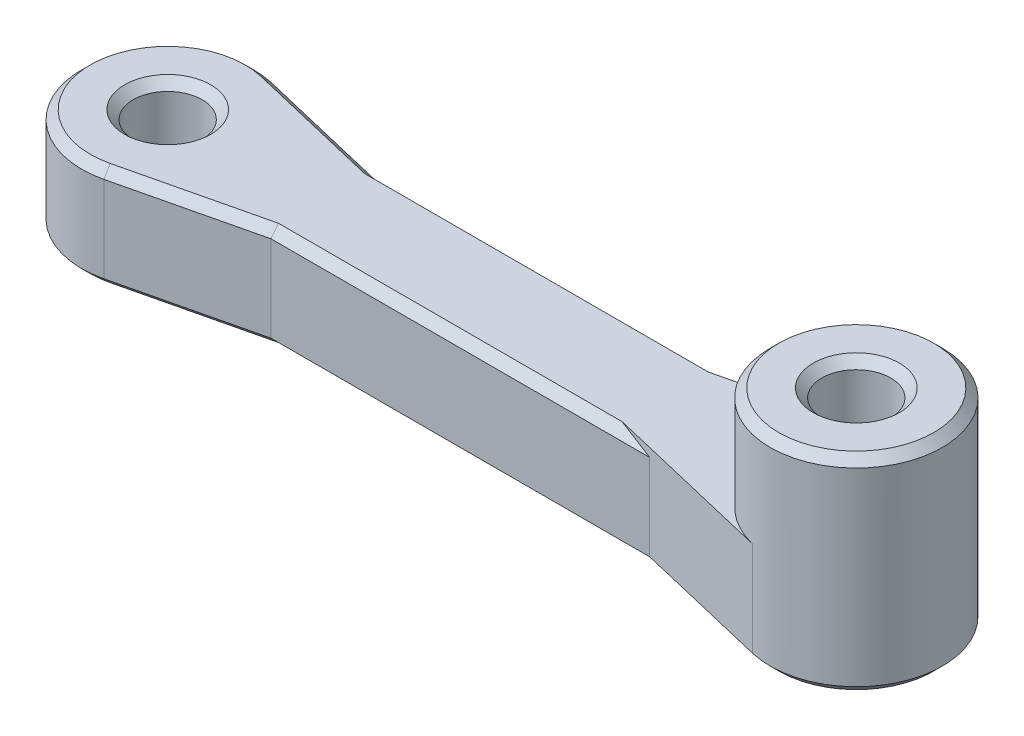
ISO-10303-21;
HEADER;
FILE_DESCRIPTION(('STEP AP214'),'2;1');
FILE_NAME('part.step','',(''),(''),'','','');
FILE_SCHEMA(('AUTOMOTIVE_DESIGN { 1 0 10303 214 1 1 1 1 }'));
ENDSEC;
DATA;
#1=APPLICATION_CONTEXT('core data for automotive mechanical design processes');
#2=APPLICATION_PROTOCOL_DEFINITION('international standard','automotive_design',2000,#1);
#3=PRODUCT_CONTEXT('',#1,'mechanical');
#4=PRODUCT('Part','Part','',(#3));
#5=PRODUCT_RELATED_PRODUCT_CATEGORY('part','',(#4));
#6=PRODUCT_DEFINITION_FORMATION('','',#4);
#7=PRODUCT_DEFINITION_CONTEXT('part definition',#1,'design');
#8=PRODUCT_DEFINITION('design','',#6,#7);
#9=PRODUCT_DEFINITION_SHAPE('','',#8);
#10=(LENGTH_UNIT() NAMED_UNIT(*) SI_UNIT(.MILLI.,.METRE.));
#11=(NAMED_UNIT(*) PLANE_ANGLE_UNIT() SI_UNIT($,.RADIAN.));
#12=(NAMED_UNIT(*) SI_UNIT($,.STERADIAN.) SOLID_ANGLE_UNIT());
#13=UNCERTAINTY_MEASURE_WITH_UNIT(LENGTH_MEASURE(1.E-05),#10,'distance_accuracy_value','');
#14=(GEOMETRIC_REPRESENTATION_CONTEXT(3) GLOBAL_UNCERTAINTY_ASSIGNED_CONTEXT((#13)) GLOBAL_UNIT_ASSIGNED_CONTEXT((#10,
#11,#12)) REPRESENTATION_CONTEXT('',''));
#15=CARTESIAN_POINT('',(0.,0.,0.));
#16=DIRECTION('',(0.,0.,1.));
#17=DIRECTION('',(1.,0.,0.));
#18=AXIS2_PLACEMENT_3D('',#15,#16,#17);
#19=CARTESIAN_POINT('',(2.,3.,-1.5));
#20=DIRECTION('',(0.,0.,1.));
#21=DIRECTION('',(1.,0.,0.));
#22=AXIS2_PLACEMENT_3D('',#19,#20,#21);
#23=PLANE('',#22);
#24=DIRECTION('',(0.,-1.,0.));
#25=VECTOR('',#24,1.);
#26=CARTESIAN_POINT('',(4.5,7.03112887414928,-1.5));
#27=LINE('',#26,#25);
#28=CARTESIAN_POINT('',(4.5,2.75,-1.5));
#29=VERTEX_POINT('',#28);
#30=CARTESIAN_POINT('',(4.5,0.25,-1.5));
#31=VERTEX_POINT('',#30);
#32=EDGE_CURVE('E196',#29,#31,#27,.T.);
#33=ORIENTED_EDGE('',*,*,#32,.F.);
#34=DIRECTION('',(1.,0.,0.));
#35=VECTOR('',#34,1.);
#36=CARTESIAN_POINT('',(15.5,2.75,-1.5));
#37=LINE('',#36,#35);
#38=CARTESIAN_POINT('',(15.5,2.75,-1.50000000000001));
#39=VERTEX_POINT('',#38);
#40=EDGE_CURVE('E295',#29,#39,#37,.T.);
#41=ORIENTED_EDGE('',*,*,#40,.T.);
#42=DIRECTION('',(0.,-1.,0.));
#43=VECTOR('',#42,1.);
#44=CARTESIAN_POINT('',(15.5,7.03112887414928,-1.50000000000001));
#45=LINE('',#44,#43);
#46=CARTESIAN_POINT('',(15.5,0.25,-1.50000000000001));
#47=VERTEX_POINT('',#46);
#48=EDGE_CURVE('E164',#39,#47,#45,.T.);
#49=ORIENTED_EDGE('',*,*,#48,.T.);
#50=DIRECTION('',(-1.,0.,0.));
#51=VECTOR('',#50,1.);
#52=CARTESIAN_POINT('',(2.,0.25,-1.5));
#53=LINE('',#52,#51);
#54=EDGE_CURVE('E229',#47,#31,#53,.T.);
#55=ORIENTED_EDGE('',*,*,#54,.T.);
#56=EDGE_LOOP('',(#33,#41,#49,#55));
#57=FACE_BOUND('',#56,.T.);
#58=ADVANCED_FACE('F43',(#57),#23,.F.);
#59=CARTESIAN_POINT('',(20.,3.,0.));
#60=DIRECTION('',(0.,-1.,0.));
#61=DIRECTION('',(0.,0.,-1.));
#62=AXIS2_PLACEMENT_3D('',#59,#60,#61);
#63=CYLINDRICAL_SURFACE('',#62,2.5);
#64=CARTESIAN_POINT('',(20.,5.75,0.));
#65=DIRECTION('',(0.,1.,0.));
#66=DIRECTION('',(0.,0.,1.));
#67=AXIS2_PLACEMENT_3D('',#64,#65,#66);
#68=CIRCLE('',#67,2.5);
#69=CARTESIAN_POINT('',(20.,5.75,2.5));
#70=VERTEX_POINT('',#69);
#71=EDGE_CURVE('E273',#70,#70,#68,.F.);
#72=ORIENTED_EDGE('',*,*,#71,.T.);
#73=EDGE_LOOP('',(#72));
#74=FACE_BOUND('',#73,.T.);
#75=DIRECTION('',(0.,-1.,0.));
#76=VECTOR('',#75,1.);
#77=CARTESIAN_POINT('',(19.4218548123582,7.03112887414928,2.4322311037413));
#78=LINE('',#77,#76);
#79=CARTESIAN_POINT('',(19.4218548123582,3.,2.4322311037413));
#80=VERTEX_POINT('',#79);
#81=CARTESIAN_POINT('',(19.4218548123582,0.25,2.4322311037413));
#82=VERTEX_POINT('',#81);
#83=EDGE_CURVE('E163',#80,#82,#78,.T.);
#84=ORIENTED_EDGE('',*,*,#83,.T.);
#85=CARTESIAN_POINT('',(20.,0.25,0.));
#86=DIRECTION('',(0.,1.,0.));
#87=DIRECTION('',(0.,0.,1.));
#88=AXIS2_PLACEMENT_3D('',#85,#86,#87);
#89=CIRCLE('',#88,2.5);
#90=CARTESIAN_POINT('',(19.4218548123582,0.25,-2.43223110374131));
#91=VERTEX_POINT('',#90);
#92=EDGE_CURVE('E172',#82,#91,#89,.T.);
#93=ORIENTED_EDGE('',*,*,#92,.T.);
#94=DIRECTION('',(0.,-1.,0.));
#95=VECTOR('',#94,1.);
#96=CARTESIAN_POINT('',(19.4218548123582,7.03112887414928,-2.43223110374131));
#97=LINE('',#96,#95);
#98=CARTESIAN_POINT('',(19.4218548123582,3.,-2.43223110374131));
#99=VERTEX_POINT('',#98);
#100=EDGE_CURVE('E155',#99,#91,#97,.T.);
#101=ORIENTED_EDGE('',*,*,#100,.F.);
#102=CARTESIAN_POINT('',(20.,3.,0.));
#103=DIRECTION('',(0.,1.,0.));
#104=DIRECTION('',(0.,0.,1.));
#105=AXIS2_PLACEMENT_3D('',#102,#103,#104);
#106=CIRCLE('',#105,2.5);
#107=EDGE_CURVE('E170',#99,#80,#106,.T.);
#108=ORIENTED_EDGE('',*,*,#107,.T.);
#109=EDGE_LOOP('',(#84,#93,#101,#108));
#110=FACE_BOUND('',#109,.T.);
#111=ADVANCED_FACE('F169',(#74,#110),#63,.T.);
#112=CARTESIAN_POINT('',(18.,3.,1.5));
#113=DIRECTION('',(0.,0.,-1.));
#114=DIRECTION('',(-1.,0.,0.));
#115=AXIS2_PLACEMENT_3D('',#112,#113,#114);
#116=PLANE('',#115);
#117=DIRECTION('',(0.,-1.,0.));
#118=VECTOR('',#117,1.);
#119=CARTESIAN_POINT('',(15.5,7.03112887414928,1.5));
#120=LINE('',#119,#118);
#121=CARTESIAN_POINT('',(15.5,2.75,1.5));
#122=VERTEX_POINT('',#121);
#123=CARTESIAN_POINT('',(15.5,0.25,1.5));
#124=VERTEX_POINT('',#123);
#125=EDGE_CURVE('E190',#122,#124,#120,.T.);
#126=ORIENTED_EDGE('',*,*,#125,.F.);
#127=DIRECTION('',(-1.,0.,0.));
#128=VECTOR('',#127,1.);
#129=CARTESIAN_POINT('',(4.5,2.75,1.5));
#130=LINE('',#129,#128);
#131=CARTESIAN_POINT('',(4.5,2.75,1.5));
#132=VERTEX_POINT('',#131);
#133=EDGE_CURVE('E66',#122,#132,#130,.T.);
#134=ORIENTED_EDGE('',*,*,#133,.T.);
#135=DIRECTION('',(0.,-1.,0.));
#136=VECTOR('',#135,1.);
#137=CARTESIAN_POINT('',(4.5,7.03112887414928,1.5));
#138=LINE('',#137,#136);
#139=CARTESIAN_POINT('',(4.5,0.25,1.5));
#140=VERTEX_POINT('',#139);
#141=EDGE_CURVE('E194',#132,#140,#138,.T.);
#142=ORIENTED_EDGE('',*,*,#141,.T.);
#143=DIRECTION('',(1.,0.,0.));
#144=VECTOR('',#143,1.);
#145=CARTESIAN_POINT('',(18.,0.25,1.5));
#146=LINE('',#145,#144);
#147=EDGE_CURVE('E241',#140,#124,#146,.T.);
#148=ORIENTED_EDGE('',*,*,#147,.T.);
#149=EDGE_LOOP('',(#126,#134,#142,#148));
#150=FACE_BOUND('',#149,.T.);
#151=ADVANCED_FACE('F339',(#150),#116,.F.);
#152=CARTESIAN_POINT('',(0.,3.,0.));
#153=DIRECTION('',(0.,-1.,0.));
#154=DIRECTION('',(0.,0.,-1.));
#155=AXIS2_PLACEMENT_3D('',#152,#153,#154);
#156=CYLINDRICAL_SURFACE('',#155,2.5);
#157=DIRECTION('',(0.,-1.,0.));
#158=VECTOR('',#157,1.);
#159=CARTESIAN_POINT('',(0.578145187641785,7.03112887414928,2.4322311037413));
#160=LINE('',#159,#158);
#161=CARTESIAN_POINT('',(0.578145187641785,2.75,2.4322311037413));
#162=VERTEX_POINT('',#161);
#163=CARTESIAN_POINT('',(0.578145187641785,0.25,2.4322311037413));
#164=VERTEX_POINT('',#163);
#165=EDGE_CURVE('E189',#162,#164,#160,.T.);
#166=ORIENTED_EDGE('',*,*,#165,.F.);
#167=CARTESIAN_POINT('',(0.,2.75,0.));
#168=DIRECTION('',(0.,1.,0.));
#169=DIRECTION('',(0.,0.,1.));
#170=AXIS2_PLACEMENT_3D('',#167,#168,#169);
#171=CIRCLE('',#170,2.5);
#172=CARTESIAN_POINT('',(0.578145187641785,2.75,-2.4322311037413));
#173=VERTEX_POINT('',#172);
#174=EDGE_CURVE('E299',#162,#173,#171,.F.);
#175=ORIENTED_EDGE('',*,*,#174,.T.);
#176=DIRECTION('',(0.,-1.,0.));
#177=VECTOR('',#176,1.);
#178=CARTESIAN_POINT('',(0.578145187641785,7.03112887414928,-2.4322311037413));
#179=LINE('',#178,#177);
#180=CARTESIAN_POINT('',(0.578145187641785,0.25,-2.4322311037413));
#181=VERTEX_POINT('',#180);
#182=EDGE_CURVE('E198',#173,#181,#179,.T.);
#183=ORIENTED_EDGE('',*,*,#182,.T.);
#184=CARTESIAN_POINT('',(0.,0.25,0.));
#185=DIRECTION('',(0.,1.,0.));
#186=DIRECTION('',(0.,0.,1.));
#187=AXIS2_PLACEMENT_3D('',#184,#185,#186);
#188=CIRCLE('',#187,2.5);
#189=EDGE_CURVE('E235',#181,#164,#188,.T.);
#190=ORIENTED_EDGE('',*,*,#189,.T.);
#191=EDGE_LOOP('',(#166,#175,#183,#190));
#192=FACE_BOUND('',#191,.T.);
#193=ADVANCED_FACE('F349',(#192),#156,.T.);
#194=CARTESIAN_POINT('',(0.,3.,0.));
#195=DIRECTION('',(0.,1.,0.));
#196=DIRECTION('',(0.,0.,1.));
#197=AXIS2_PLACEMENT_3D('',#194,#195,#196);
#198=PLANE('',#197);
#199=CARTESIAN_POINT('',(0.,3.,0.));
#200=DIRECTION('',(0.,1.,0.));
#201=DIRECTION('',(0.,0.,1.));
#202=AXIS2_PLACEMENT_3D('',#199,#200,#201);
#203=CIRCLE('',#202,1.25);
#204=CARTESIAN_POINT('',(0.,3.,1.25));
#205=VERTEX_POINT('',#204);
#206=EDGE_CURVE('E292',#205,#205,#203,.F.);
#207=ORIENTED_EDGE('',*,*,#206,.T.);
#208=EDGE_LOOP('',(#207));
#209=FACE_BOUND('',#208,.T.);
#210=DIRECTION('',(-0.972892441496522,0.,0.231258075056714));
#211=VECTOR('',#210,1.);
#212=CARTESIAN_POINT('',(15.5,3.,-1.50000000000001));
#213=LINE('',#212,#211);
#214=CARTESIAN_POINT('',(14.4482611134142,3.,-1.25));
#215=VERTEX_POINT('',#214);
#216=EDGE_CURVE('E151',#99,#215,#213,.T.);
#217=ORIENTED_EDGE('',*,*,#216,.T.);
#218=DIRECTION('',(-1.,0.,0.));
#219=VECTOR('',#218,1.);
#220=CARTESIAN_POINT('',(4.5,3.,-1.25));
#221=LINE('',#220,#219);
#222=CARTESIAN_POINT('',(4.47069555463433,3.,-1.25));
#223=VERTEX_POINT('',#222);
#224=EDGE_CURVE('E290',#215,#223,#221,.T.);
#225=ORIENTED_EDGE('',*,*,#224,.T.);
#226=DIRECTION('',(-0.972892441496522,0.,-0.231258075056714));
#227=VECTOR('',#226,1.);
#228=CARTESIAN_POINT('',(0.520330668877606,3.,-2.18900799336717));
#229=LINE('',#228,#227);
#230=CARTESIAN_POINT('',(0.520330668877606,3.,-2.18900799336717));
#231=VERTEX_POINT('',#230);
#232=EDGE_CURVE('E288',#223,#231,#229,.T.);
#233=ORIENTED_EDGE('',*,*,#232,.T.);
#234=CARTESIAN_POINT('',(0.,3.,0.));
#235=DIRECTION('',(0.,1.,0.));
#236=DIRECTION('',(0.,0.,1.));
#237=AXIS2_PLACEMENT_3D('',#234,#235,#236);
#238=CIRCLE('',#237,2.25);
#239=CARTESIAN_POINT('',(0.520330668877607,3.,2.18900799336717));
#240=VERTEX_POINT('',#239);
#241=EDGE_CURVE('E286',#231,#240,#238,.T.);
#242=ORIENTED_EDGE('',*,*,#241,.T.);
#243=DIRECTION('',(0.972892441496522,0.,-0.231258075056714));
#244=VECTOR('',#243,1.);
#245=CARTESIAN_POINT('',(4.44218548123582,3.,1.25677688962587));
#246=LINE('',#245,#244);
#247=CARTESIAN_POINT('',(4.47069555463433,3.,1.25));
#248=VERTEX_POINT('',#247);
#249=EDGE_CURVE('E284',#240,#248,#246,.T.);
#250=ORIENTED_EDGE('',*,*,#249,.T.);
#251=DIRECTION('',(1.,0.,0.));
#252=VECTOR('',#251,1.);
#253=CARTESIAN_POINT('',(15.5000000000001,3.,1.25));
#254=LINE('',#253,#252);
#255=CARTESIAN_POINT('',(14.4482611134142,3.,1.25));
#256=VERTEX_POINT('',#255);
#257=EDGE_CURVE('E282',#248,#256,#254,.T.);
#258=ORIENTED_EDGE('',*,*,#257,.T.);
#259=DIRECTION('',(0.972892441496522,0.,0.231258075056715));
#260=VECTOR('',#259,1.);
#261=CARTESIAN_POINT('',(15.5,3.,1.5));
#262=LINE('',#261,#260);
#263=EDGE_CURVE('E178',#256,#80,#262,.T.);
#264=ORIENTED_EDGE('',*,*,#263,.T.);
#265=ORIENTED_EDGE('',*,*,#107,.F.);
#266=EDGE_LOOP('',(#217,#225,#233,#242,#250,#258,#264,#265));
#267=FACE_BOUND('',#266,.T.);
#268=ADVANCED_FACE('F176',(#209,#267),#198,.T.);
#269=CARTESIAN_POINT('',(0.,0.,0.));
#270=DIRECTION('',(0.,1.,0.));
#271=DIRECTION('',(0.,0.,1.));
#272=AXIS2_PLACEMENT_3D('',#269,#270,#271);
#273=PLANE('',#272);
#274=CARTESIAN_POINT('',(20.,0.,0.));
#275=DIRECTION('',(0.,1.,0.));
#276=DIRECTION('',(0.,0.,1.));
#277=AXIS2_PLACEMENT_3D('',#274,#275,#276);
#278=CIRCLE('',#277,1.25);
#279=CARTESIAN_POINT('',(20.,0.,1.25));
#280=VERTEX_POINT('',#279);
#281=EDGE_CURVE('E220',#280,#280,#278,.T.);
#282=ORIENTED_EDGE('',*,*,#281,.T.);
#283=EDGE_LOOP('',(#282));
#284=FACE_BOUND('',#283,.T.);
#285=CARTESIAN_POINT('',(0.,0.,0.));
#286=DIRECTION('',(0.,1.,0.));
#287=DIRECTION('',(0.,0.,1.));
#288=AXIS2_PLACEMENT_3D('',#285,#286,#287);
#289=CIRCLE('',#288,1.25);
#290=CARTESIAN_POINT('',(0.,0.,1.25));
#291=VERTEX_POINT('',#290);
#292=EDGE_CURVE('E217',#291,#291,#289,.T.);
#293=ORIENTED_EDGE('',*,*,#292,.T.);
#294=EDGE_LOOP('',(#293));
#295=FACE_BOUND('',#294,.T.);
#296=DIRECTION('',(0.972892441496522,0.,0.231258075056714));
#297=VECTOR('',#296,1.);
#298=CARTESIAN_POINT('',(0.520330668877606,0.,-2.18900799336717));
#299=LINE('',#298,#297);
#300=CARTESIAN_POINT('',(0.520330668877607,0.,-2.18900799336717));
#301=VERTEX_POINT('',#300);
#302=CARTESIAN_POINT('',(4.47069555463433,0.,-1.25));
#303=VERTEX_POINT('',#302);
#304=EDGE_CURVE('E212',#301,#303,#299,.T.);
#305=ORIENTED_EDGE('',*,*,#304,.T.);
#306=DIRECTION('',(1.,0.,0.));
#307=VECTOR('',#306,1.);
#308=CARTESIAN_POINT('',(0.,0.,-1.25));
#309=LINE('',#308,#307);
#310=CARTESIAN_POINT('',(15.5293044453657,0.,-1.25));
#311=VERTEX_POINT('',#310);
#312=EDGE_CURVE('E214',#303,#311,#309,.T.);
#313=ORIENTED_EDGE('',*,*,#312,.T.);
#314=DIRECTION('',(0.972892441496522,0.,-0.231258075056714));
#315=VECTOR('',#314,1.);
#316=CARTESIAN_POINT('',(0.549275276701128,0.,2.31077667178707));
#317=LINE('',#316,#315);
#318=CARTESIAN_POINT('',(19.4796693311224,0.,-2.18900799336717));
#319=VERTEX_POINT('',#318);
#320=EDGE_CURVE('E200',#311,#319,#317,.T.);
#321=ORIENTED_EDGE('',*,*,#320,.T.);
#322=CARTESIAN_POINT('',(20.,0.,0.));
#323=DIRECTION('',(0.,1.,0.));
#324=DIRECTION('',(0.,0.,1.));
#325=AXIS2_PLACEMENT_3D('',#322,#323,#324);
#326=CIRCLE('',#325,2.25);
#327=CARTESIAN_POINT('',(19.4796693311224,0.,2.18900799336717));
#328=VERTEX_POINT('',#327);
#329=EDGE_CURVE('E202',#319,#328,#326,.F.);
#330=ORIENTED_EDGE('',*,*,#329,.T.);
#331=DIRECTION('',(-0.972892441496522,0.,-0.231258075056715));
#332=VECTOR('',#331,1.);
#333=CARTESIAN_POINT('',(0.549275276701135,0.,-2.31077667178709));
#334=LINE('',#333,#332);
#335=CARTESIAN_POINT('',(15.5293044453657,0.,1.25));
#336=VERTEX_POINT('',#335);
#337=EDGE_CURVE('E204',#328,#336,#334,.T.);
#338=ORIENTED_EDGE('',*,*,#337,.T.);
#339=DIRECTION('',(-1.,0.,0.));
#340=VECTOR('',#339,1.);
#341=CARTESIAN_POINT('',(0.,0.,1.25));
#342=LINE('',#341,#340);
#343=CARTESIAN_POINT('',(4.47069555463433,0.,1.25));
#344=VERTEX_POINT('',#343);
#345=EDGE_CURVE('E206',#336,#344,#342,.T.);
#346=ORIENTED_EDGE('',*,*,#345,.T.);
#347=DIRECTION('',(-0.972892441496522,0.,0.231258075056714));
#348=VECTOR('',#347,1.);
#349=CARTESIAN_POINT('',(0.520330668877607,0.,2.18900799336717));
#350=LINE('',#349,#348);
#351=CARTESIAN_POINT('',(0.520330668877607,0.,2.18900799336717));
#352=VERTEX_POINT('',#351);
#353=EDGE_CURVE('E208',#344,#352,#350,.T.);
#354=ORIENTED_EDGE('',*,*,#353,.T.);
#355=CARTESIAN_POINT('',(0.,0.,0.));
#356=DIRECTION('',(0.,1.,0.));
#357=DIRECTION('',(0.,0.,1.));
#358=AXIS2_PLACEMENT_3D('',#355,#356,#357);
#359=CIRCLE('',#358,2.25);
#360=EDGE_CURVE('E210',#352,#301,#359,.F.);
#361=ORIENTED_EDGE('',*,*,#360,.T.);
#362=EDGE_LOOP('',(#305,#313,#321,#330,#338,#346,#354,#361));
#363=FACE_BOUND('',#362,.T.);
#364=ADVANCED_FACE('F344',(#284,#295,#363),#273,.F.);
#365=CARTESIAN_POINT('',(20.,5.82842712474619,0.));
#366=DIRECTION('',(0.,-1.,0.));
#367=DIRECTION('',(0.,0.,-1.));
#368=AXIS2_PLACEMENT_3D('',#365,#366,#367);
#369=CYLINDRICAL_SURFACE('',#368,1.);
#370=CARTESIAN_POINT('',(20.,5.75,0.));
#371=DIRECTION('',(0.,1.,0.));
#372=DIRECTION('',(0.,0.,1.));
#373=AXIS2_PLACEMENT_3D('',#370,#371,#372);
#374=CIRCLE('',#373,1.);
#375=CARTESIAN_POINT('',(20.,5.75,1.));
#376=VERTEX_POINT('',#375);
#377=EDGE_CURVE('E276',#376,#376,#374,.T.);
#378=ORIENTED_EDGE('',*,*,#377,.T.);
#379=EDGE_LOOP('',(#378));
#380=FACE_BOUND('',#379,.T.);
#381=CARTESIAN_POINT('',(20.,0.249999999999999,0.));
#382=DIRECTION('',(0.,1.,0.));
#383=DIRECTION('',(0.,0.,1.));
#384=AXIS2_PLACEMENT_3D('',#381,#382,#383);
#385=CIRCLE('',#384,1.);
#386=CARTESIAN_POINT('',(20.,0.249999999999999,1.));
#387=VERTEX_POINT('',#386);
#388=EDGE_CURVE('E223',#387,#387,#385,.F.);
#389=ORIENTED_EDGE('',*,*,#388,.T.);
#390=EDGE_LOOP('',(#389));
#391=FACE_BOUND('',#390,.T.);
#392=ADVANCED_FACE('F501',(#380,#391),#369,.F.);
#393=CARTESIAN_POINT('',(0.,5.82842712474619,0.));
#394=DIRECTION('',(0.,-1.,0.));
#395=DIRECTION('',(0.,0.,-1.));
#396=AXIS2_PLACEMENT_3D('',#393,#394,#395);
#397=CYLINDRICAL_SURFACE('',#396,1.);
#398=CARTESIAN_POINT('',(0.,2.75,0.));
#399=DIRECTION('',(0.,1.,0.));
#400=DIRECTION('',(0.,0.,1.));
#401=AXIS2_PLACEMENT_3D('',#398,#399,#400);
#402=CIRCLE('',#401,1.);
#403=CARTESIAN_POINT('',(0.,2.75,1.));
#404=VERTEX_POINT('',#403);
#405=EDGE_CURVE('E279',#404,#404,#402,.T.);
#406=ORIENTED_EDGE('',*,*,#405,.T.);
#407=EDGE_LOOP('',(#406));
#408=FACE_BOUND('',#407,.T.);
#409=CARTESIAN_POINT('',(0.,0.250000000000001,0.));
#410=DIRECTION('',(0.,1.,0.));
#411=DIRECTION('',(0.,0.,1.));
#412=AXIS2_PLACEMENT_3D('',#409,#410,#411);
#413=CIRCLE('',#412,1.);
#414=CARTESIAN_POINT('',(0.,0.250000000000001,1.));
#415=VERTEX_POINT('',#414);
#416=EDGE_CURVE('E226',#415,#415,#413,.F.);
#417=ORIENTED_EDGE('',*,*,#416,.T.);
#418=EDGE_LOOP('',(#417));
#419=FACE_BOUND('',#418,.T.);
#420=ADVANCED_FACE('F507',(#408,#419),#397,.F.);
#421=CARTESIAN_POINT('',(4.5,7.03112887414928,-1.5));
#422=DIRECTION('',(-0.231258075056714,0.,0.972892441496522));
#423=DIRECTION('',(0.972892441496522,0.,0.231258075056714));
#424=AXIS2_PLACEMENT_3D('',#421,#422,#423);
#425=PLANE('',#424);
#426=ORIENTED_EDGE('',*,*,#182,.F.);
#427=DIRECTION('',(0.972892441496522,0.,0.231258075056714));
#428=VECTOR('',#427,1.);
#429=CARTESIAN_POINT('',(4.5,2.75,-1.5));
#430=LINE('',#429,#428);
#431=EDGE_CURVE('E297',#173,#29,#430,.T.);
#432=ORIENTED_EDGE('',*,*,#431,.T.);
#433=ORIENTED_EDGE('',*,*,#32,.T.);
#434=DIRECTION('',(-0.972892441496522,0.,-0.231258075056714));
#435=VECTOR('',#434,1.);
#436=CARTESIAN_POINT('',(4.5,0.25,-1.5));
#437=LINE('',#436,#435);
#438=EDGE_CURVE('E232',#31,#181,#437,.T.);
#439=ORIENTED_EDGE('',*,*,#438,.T.);
#440=EDGE_LOOP('',(#426,#432,#433,#439));
#441=FACE_BOUND('',#440,.T.);
#442=ADVANCED_FACE('F583',(#441),#425,.F.);
#443=CARTESIAN_POINT('',(4.5,7.03112887414928,1.5));
#444=DIRECTION('',(-0.231258075056714,0.,-0.972892441496522));
#445=DIRECTION('',(-0.972892441496522,0.,0.231258075056714));
#446=AXIS2_PLACEMENT_3D('',#443,#444,#445);
#447=PLANE('',#446);
#448=ORIENTED_EDGE('',*,*,#141,.F.);
#449=DIRECTION('',(-0.972892441496522,0.,0.231258075056714));
#450=VECTOR('',#449,1.);
#451=CARTESIAN_POINT('',(0.578145187641785,2.75,2.4322311037413));
#452=LINE('',#451,#450);
#453=EDGE_CURVE('E301',#132,#162,#452,.T.);
#454=ORIENTED_EDGE('',*,*,#453,.T.);
#455=ORIENTED_EDGE('',*,*,#165,.T.);
#456=DIRECTION('',(0.972892441496522,0.,-0.231258075056714));
#457=VECTOR('',#456,1.);
#458=CARTESIAN_POINT('',(4.5,0.25,1.5));
#459=LINE('',#458,#457);
#460=EDGE_CURVE('E238',#164,#140,#459,.T.);
#461=ORIENTED_EDGE('',*,*,#460,.T.);
#462=EDGE_LOOP('',(#448,#454,#455,#461));
#463=FACE_BOUND('',#462,.T.);
#464=ADVANCED_FACE('F576',(#463),#447,.F.);
#465=CARTESIAN_POINT('',(15.5,7.03112887414928,1.5));
#466=DIRECTION('',(0.231258075056715,0.,-0.972892441496522));
#467=DIRECTION('',(-0.972892441496522,0.,-0.231258075056715));
#468=AXIS2_PLACEMENT_3D('',#465,#466,#467);
#469=PLANE('',#468);
#470=ORIENTED_EDGE('',*,*,#263,.F.);
#471=DIRECTION('',(0.947876203725968,-0.225311675696188,0.225311675696185));
#472=VECTOR('',#471,1.);
#473=CARTESIAN_POINT('',(14.5856896846005,2.96733301085016,1.28266698914985));
#474=LINE('',#473,#472);
#475=EDGE_CURVE('E11',#256,#122,#474,.T.);
#476=ORIENTED_EDGE('',*,*,#475,.T.);
#477=ORIENTED_EDGE('',*,*,#125,.T.);
#478=DIRECTION('',(0.972892441496522,0.,0.231258075056715));
#479=VECTOR('',#478,1.);
#480=CARTESIAN_POINT('',(15.5,0.25,1.5));
#481=LINE('',#480,#479);
#482=EDGE_CURVE('E244',#124,#82,#481,.T.);
#483=ORIENTED_EDGE('',*,*,#482,.T.);
#484=ORIENTED_EDGE('',*,*,#83,.F.);
#485=EDGE_LOOP('',(#470,#476,#477,#483,#484));
#486=FACE_BOUND('',#485,.T.);
#487=ADVANCED_FACE('F569',(#486),#469,.F.);
#488=CARTESIAN_POINT('',(15.5,7.03112887414928,-1.50000000000001));
#489=DIRECTION('',(0.231258075056714,0.,0.972892441496522));
#490=DIRECTION('',(0.972892441496522,0.,-0.231258075056714));
#491=AXIS2_PLACEMENT_3D('',#488,#489,#490);
#492=PLANE('',#491);
#493=ORIENTED_EDGE('',*,*,#100,.T.);
#494=DIRECTION('',(-0.972892441496522,0.,0.231258075056714));
#495=VECTOR('',#494,1.);
#496=CARTESIAN_POINT('',(15.5,0.25,-1.50000000000001));
#497=LINE('',#496,#495);
#498=EDGE_CURVE('E247',#91,#47,#497,.T.);
#499=ORIENTED_EDGE('',*,*,#498,.T.);
#500=ORIENTED_EDGE('',*,*,#48,.F.);
#501=DIRECTION('',(-0.947876203725969,0.225311675696187,0.225311675696184));
#502=VECTOR('',#501,1.);
#503=CARTESIAN_POINT('',(14.5856896846005,2.96733301085015,-1.28266698914985));
#504=LINE('',#503,#502);
#505=EDGE_CURVE('E53',#39,#215,#504,.T.);
#506=ORIENTED_EDGE('',*,*,#505,.T.);
#507=ORIENTED_EDGE('',*,*,#216,.F.);
#508=EDGE_LOOP('',(#493,#499,#500,#506,#507));
#509=FACE_BOUND('',#508,.T.);
#510=ADVANCED_FACE('F153',(#509),#492,.F.);
#511=CARTESIAN_POINT('',(20.,0.,0.));
#512=DIRECTION('',(0.,-1.,0.));
#513=DIRECTION('',(0.,0.,-1.));
#514=AXIS2_PLACEMENT_3D('',#511,#512,#513);
#515=CONICAL_SURFACE('',#514,1.25,0.785398163397449);
#516=ORIENTED_EDGE('',*,*,#388,.F.);
#517=EDGE_LOOP('',(#516));
#518=FACE_BOUND('',#517,.T.);
#519=ORIENTED_EDGE('',*,*,#281,.F.);
#520=EDGE_LOOP('',(#519));
#521=FACE_BOUND('',#520,.T.);
#522=ADVANCED_FACE('F354',(#518,#521),#515,.F.);
#523=CARTESIAN_POINT('',(0.,0.,0.));
#524=DIRECTION('',(0.,-1.,0.));
#525=DIRECTION('',(0.,0.,-1.));
#526=AXIS2_PLACEMENT_3D('',#523,#524,#525);
#527=CONICAL_SURFACE('',#526,1.25,0.785398163397448);
#528=ORIENTED_EDGE('',*,*,#416,.F.);
#529=EDGE_LOOP('',(#528));
#530=FACE_BOUND('',#529,.T.);
#531=ORIENTED_EDGE('',*,*,#292,.F.);
#532=EDGE_LOOP('',(#531));
#533=FACE_BOUND('',#532,.T.);
#534=ADVANCED_FACE('F360',(#530,#533),#527,.F.);
#535=CARTESIAN_POINT('',(18.,0.25,1.5));
#536=DIRECTION('',(0.,0.707106781186547,-0.707106781186548));
#537=DIRECTION('',(1.,0.,0.));
#538=AXIS2_PLACEMENT_3D('',#535,#536,#537);
#539=PLANE('',#538);
#540=DIRECTION('',(-0.082602234954588,-0.704690311690358,-0.704690311690358));
#541=VECTOR('',#540,1.);
#542=CARTESIAN_POINT('',(4.5,0.25,1.5));
#543=LINE('',#542,#541);
#544=EDGE_CURVE('E263',#344,#140,#543,.F.);
#545=ORIENTED_EDGE('',*,*,#544,.F.);
#546=ORIENTED_EDGE('',*,*,#345,.F.);
#547=DIRECTION('',(0.0826022349545958,-0.704690311690358,-0.704690311690357));
#548=VECTOR('',#547,1.);
#549=CARTESIAN_POINT('',(15.5170578230487,0.104477513258815,1.35447751325882));
#550=LINE('',#549,#548);
#551=EDGE_CURVE('E173',#124,#336,#550,.T.);
#552=ORIENTED_EDGE('',*,*,#551,.F.);
#553=ORIENTED_EDGE('',*,*,#147,.F.);
#554=EDGE_LOOP('',(#545,#546,#552,#553));
#555=FACE_BOUND('',#554,.T.);
#556=ADVANCED_FACE('F367',(#555),#539,.F.);
#557=CARTESIAN_POINT('',(15.5,0.25,1.5));
#558=DIRECTION('',(0.163524153076751,0.707106781186548,-0.687938842747326));
#559=DIRECTION('',(0.972892441496522,0.,0.231258075056715));
#560=AXIS2_PLACEMENT_3D('',#557,#558,#559);
#561=PLANE('',#560);
#562=ORIENTED_EDGE('',*,*,#551,.T.);
#563=ORIENTED_EDGE('',*,*,#337,.F.);
#564=DIRECTION('',(0.163524153076746,-0.707106781186546,-0.687938842747329));
#565=VECTOR('',#564,1.);
#566=CARTESIAN_POINT('',(19.4218548123582,0.25,2.4322311037413));
#567=LINE('',#566,#565);
#568=EDGE_CURVE('E260',#82,#328,#567,.T.);
#569=ORIENTED_EDGE('',*,*,#568,.F.);
#570=ORIENTED_EDGE('',*,*,#482,.F.);
#571=EDGE_LOOP('',(#562,#563,#569,#570));
#572=FACE_BOUND('',#571,.T.);
#573=ADVANCED_FACE('F412',(#572),#561,.F.);
#574=CARTESIAN_POINT('',(4.5,0.25,1.5));
#575=DIRECTION('',(-0.16352415307675,0.707106781186547,-0.687938842747327));
#576=DIRECTION('',(0.972892441496522,0.,-0.231258075056714));
#577=AXIS2_PLACEMENT_3D('',#574,#575,#576);
#578=PLANE('',#577);
#579=ORIENTED_EDGE('',*,*,#544,.T.);
#580=ORIENTED_EDGE('',*,*,#460,.F.);
#581=DIRECTION('',(0.16352415307675,0.707106781186548,0.687938842747327));
#582=VECTOR('',#581,1.);
#583=CARTESIAN_POINT('',(0.520330668877607,0.,2.18900799336717));
#584=LINE('',#583,#582);
#585=EDGE_CURVE('E257',#352,#164,#584,.T.);
#586=ORIENTED_EDGE('',*,*,#585,.F.);
#587=ORIENTED_EDGE('',*,*,#353,.F.);
#588=EDGE_LOOP('',(#579,#580,#586,#587));
#589=FACE_BOUND('',#588,.T.);
#590=ADVANCED_FACE('F405',(#589),#578,.F.);
#591=CARTESIAN_POINT('',(20.,0.25,0.));
#592=DIRECTION('',(0.,1.,0.));
#593=DIRECTION('',(0.,0.,1.));
#594=AXIS2_PLACEMENT_3D('',#591,#592,#593);
#595=CONICAL_SURFACE('',#594,2.5,0.785398163397447);
#596=ORIENTED_EDGE('',*,*,#568,.T.);
#597=ORIENTED_EDGE('',*,*,#329,.F.);
#598=DIRECTION('',(0.163524153076747,-0.707106781186548,0.687938842747327));
#599=VECTOR('',#598,1.);
#600=CARTESIAN_POINT('',(19.4218548123582,0.25,-2.4322311037413));
#601=LINE('',#600,#599);
#602=EDGE_CURVE('E254',#91,#319,#601,.T.);
#603=ORIENTED_EDGE('',*,*,#602,.F.);
#604=ORIENTED_EDGE('',*,*,#92,.F.);
#605=EDGE_LOOP('',(#596,#597,#603,#604));
#606=FACE_BOUND('',#605,.T.);
#607=ADVANCED_FACE('F398',(#606),#595,.T.);
#608=CARTESIAN_POINT('',(0.,0.25,0.));
#609=DIRECTION('',(0.,1.,0.));
#610=DIRECTION('',(0.,0.,1.));
#611=AXIS2_PLACEMENT_3D('',#608,#609,#610);
#612=CONICAL_SURFACE('',#611,2.5,0.785398163397447);
#613=ORIENTED_EDGE('',*,*,#585,.T.);
#614=ORIENTED_EDGE('',*,*,#189,.F.);
#615=DIRECTION('',(0.16352415307675,0.707106781186549,-0.687938842747326));
#616=VECTOR('',#615,1.);
#617=CARTESIAN_POINT('',(0.520330668877607,0.,-2.18900799336717));
#618=LINE('',#617,#616);
#619=EDGE_CURVE('E251',#301,#181,#618,.T.);
#620=ORIENTED_EDGE('',*,*,#619,.F.);
#621=ORIENTED_EDGE('',*,*,#360,.F.);
#622=EDGE_LOOP('',(#613,#614,#620,#621));
#623=FACE_BOUND('',#622,.T.);
#624=ADVANCED_FACE('F391',(#623),#612,.T.);
#625=CARTESIAN_POINT('',(15.5,0.25,-1.50000000000001));
#626=DIRECTION('',(0.16352415307675,0.707106781186547,0.687938842747327));
#627=DIRECTION('',(-0.972892441496522,0.,0.231258075056714));
#628=AXIS2_PLACEMENT_3D('',#625,#626,#627);
#629=PLANE('',#628);
#630=ORIENTED_EDGE('',*,*,#602,.T.);
#631=ORIENTED_EDGE('',*,*,#320,.F.);
#632=DIRECTION('',(-0.0826022349545898,0.704690311690358,-0.704690311690357));
#633=VECTOR('',#632,1.);
#634=CARTESIAN_POINT('',(15.4078877555368,1.03582142840235,-2.28582142840235));
#635=LINE('',#634,#633);
#636=EDGE_CURVE('E182',#47,#311,#635,.F.);
#637=ORIENTED_EDGE('',*,*,#636,.F.);
#638=ORIENTED_EDGE('',*,*,#498,.F.);
#639=EDGE_LOOP('',(#630,#631,#637,#638));
#640=FACE_BOUND('',#639,.T.);
#641=ADVANCED_FACE('F384',(#640),#629,.F.);
#642=CARTESIAN_POINT('',(4.5,0.25,-1.5));
#643=DIRECTION('',(-0.16352415307675,0.707106781186547,0.687938842747328));
#644=DIRECTION('',(-0.972892441496522,0.,-0.231258075056714));
#645=AXIS2_PLACEMENT_3D('',#642,#643,#644);
#646=PLANE('',#645);
#647=ORIENTED_EDGE('',*,*,#619,.T.);
#648=ORIENTED_EDGE('',*,*,#438,.F.);
#649=DIRECTION('',(-0.082602234954584,-0.704690311690358,0.704690311690358));
#650=VECTOR('',#649,1.);
#651=CARTESIAN_POINT('',(4.48294217695127,0.104477513258835,-1.35447751325884));
#652=LINE('',#651,#650);
#653=EDGE_CURVE('E179',#303,#31,#652,.F.);
#654=ORIENTED_EDGE('',*,*,#653,.F.);
#655=ORIENTED_EDGE('',*,*,#304,.F.);
#656=EDGE_LOOP('',(#647,#648,#654,#655));
#657=FACE_BOUND('',#656,.T.);
#658=ADVANCED_FACE('F377',(#657),#646,.F.);
#659=CARTESIAN_POINT('',(2.,0.25,-1.5));
#660=DIRECTION('',(0.,0.707106781186547,0.707106781186548));
#661=DIRECTION('',(-1.,0.,0.));
#662=AXIS2_PLACEMENT_3D('',#659,#660,#661);
#663=PLANE('',#662);
#664=ORIENTED_EDGE('',*,*,#636,.T.);
#665=ORIENTED_EDGE('',*,*,#312,.F.);
#666=ORIENTED_EDGE('',*,*,#653,.T.);
#667=ORIENTED_EDGE('',*,*,#54,.F.);
#668=EDGE_LOOP('',(#664,#665,#666,#667));
#669=FACE_BOUND('',#668,.T.);
#670=ADVANCED_FACE('F370',(#669),#663,.F.);
#671=CARTESIAN_POINT('',(20.,6.,0.));
#672=DIRECTION('',(0.,1.,0.));
#673=DIRECTION('',(0.,0.,1.));
#674=AXIS2_PLACEMENT_3D('',#671,#672,#673);
#675=PLANE('',#674);
#676=CARTESIAN_POINT('',(20.,6.,0.));
#677=DIRECTION('',(0.,1.,0.));
#678=DIRECTION('',(0.,0.,1.));
#679=AXIS2_PLACEMENT_3D('',#676,#677,#678);
#680=CIRCLE('',#679,2.25);
#681=CARTESIAN_POINT('',(20.,6.,2.25));
#682=VERTEX_POINT('',#681);
#683=EDGE_CURVE('E270',#682,#682,#680,.T.);
#684=ORIENTED_EDGE('',*,*,#683,.T.);
#685=EDGE_LOOP('',(#684));
#686=FACE_BOUND('',#685,.T.);
#687=CARTESIAN_POINT('',(20.,6.,0.));
#688=DIRECTION('',(0.,1.,0.));
#689=DIRECTION('',(0.,0.,1.));
#690=AXIS2_PLACEMENT_3D('',#687,#688,#689);
#691=CIRCLE('',#690,1.25);
#692=CARTESIAN_POINT('',(20.,6.,1.25));
#693=VERTEX_POINT('',#692);
#694=EDGE_CURVE('E248',#693,#693,#691,.F.);
#695=ORIENTED_EDGE('',*,*,#694,.T.);
#696=EDGE_LOOP('',(#695));
#697=FACE_BOUND('',#696,.T.);
#698=ADVANCED_FACE('F376',(#686,#697),#675,.T.);
#699=CARTESIAN_POINT('',(20.,6.,0.));
#700=DIRECTION('',(0.,-1.,0.));
#701=DIRECTION('',(0.,0.,-1.));
#702=AXIS2_PLACEMENT_3D('',#699,#700,#701);
#703=CONICAL_SURFACE('',#702,2.25,0.785398163397439);
#704=ORIENTED_EDGE('',*,*,#71,.F.);
#705=EDGE_LOOP('',(#704));
#706=FACE_BOUND('',#705,.T.);
#707=ORIENTED_EDGE('',*,*,#683,.F.);
#708=EDGE_LOOP('',(#707));
#709=FACE_BOUND('',#708,.T.);
#710=ADVANCED_FACE('F424',(#706,#709),#703,.T.);
#711=CARTESIAN_POINT('',(20.,5.75,0.));
#712=DIRECTION('',(0.,1.,0.));
#713=DIRECTION('',(0.,0.,1.));
#714=AXIS2_PLACEMENT_3D('',#711,#712,#713);
#715=CONICAL_SURFACE('',#714,1.,0.785398163397456);
#716=ORIENTED_EDGE('',*,*,#694,.F.);
#717=EDGE_LOOP('',(#716));
#718=FACE_BOUND('',#717,.T.);
#719=ORIENTED_EDGE('',*,*,#377,.F.);
#720=EDGE_LOOP('',(#719));
#721=FACE_BOUND('',#720,.T.);
#722=ADVANCED_FACE('F329',(#718,#721),#715,.F.);
#723=CARTESIAN_POINT('',(0.,2.75,0.));
#724=DIRECTION('',(0.,1.,0.));
#725=DIRECTION('',(0.,0.,1.));
#726=AXIS2_PLACEMENT_3D('',#723,#724,#725);
#727=CONICAL_SURFACE('',#726,1.,0.785398163397455);
#728=ORIENTED_EDGE('',*,*,#206,.F.);
#729=EDGE_LOOP('',(#728));
#730=FACE_BOUND('',#729,.T.);
#731=ORIENTED_EDGE('',*,*,#405,.F.);
#732=EDGE_LOOP('',(#731));
#733=FACE_BOUND('',#732,.T.);
#734=ADVANCED_FACE('F324',(#730,#733),#727,.F.);
#735=CARTESIAN_POINT('',(0.,3.,1.25));
#736=DIRECTION('',(0.,0.707106781186543,0.707106781186552));
#737=DIRECTION('',(-1.,0.,0.));
#738=AXIS2_PLACEMENT_3D('',#735,#736,#737);
#739=PLANE('',#738);
#740=ORIENTED_EDGE('',*,*,#475,.F.);
#741=ORIENTED_EDGE('',*,*,#257,.F.);
#742=DIRECTION('',(0.0826022349545851,-0.704690311690363,0.704690311690353));
#743=VECTOR('',#742,1.);
#744=CARTESIAN_POINT('',(4.49840041586051,2.76364625843898,1.48635374156102));
#745=LINE('',#744,#743);
#746=EDGE_CURVE('E48',#132,#248,#745,.F.);
#747=ORIENTED_EDGE('',*,*,#746,.F.);
#748=ORIENTED_EDGE('',*,*,#133,.F.);
#749=EDGE_LOOP('',(#740,#741,#747,#748));
#750=FACE_BOUND('',#749,.T.);
#751=ADVANCED_FACE('F46',(#750),#739,.T.);
#752=CARTESIAN_POINT('',(0.520330668877607,3.,2.18900799336717));
#753=DIRECTION('',(0.163524153076751,0.707106781186542,0.687938842747332));
#754=DIRECTION('',(-0.972892441496522,0.,0.231258075056714));
#755=AXIS2_PLACEMENT_3D('',#752,#753,#754);
#756=PLANE('',#755);
#757=ORIENTED_EDGE('',*,*,#746,.T.);
#758=ORIENTED_EDGE('',*,*,#249,.F.);
#759=DIRECTION('',(-0.163524153076749,0.707106781186553,-0.687938842747322));
#760=VECTOR('',#759,1.);
#761=CARTESIAN_POINT('',(0.578145187641785,2.75,2.4322311037413));
#762=LINE('',#761,#760);
#763=EDGE_CURVE('E185',#162,#240,#762,.T.);
#764=ORIENTED_EDGE('',*,*,#763,.F.);
#765=ORIENTED_EDGE('',*,*,#453,.F.);
#766=EDGE_LOOP('',(#757,#758,#764,#765));
#767=FACE_BOUND('',#766,.T.);
#768=ADVANCED_FACE('F319',(#767),#756,.T.);
#769=CARTESIAN_POINT('',(0.,3.,0.));
#770=DIRECTION('',(0.,-1.,0.));
#771=DIRECTION('',(0.,0.,-1.));
#772=AXIS2_PLACEMENT_3D('',#769,#770,#771);
#773=CONICAL_SURFACE('',#772,2.25,0.785398163397441);
#774=ORIENTED_EDGE('',*,*,#763,.T.);
#775=ORIENTED_EDGE('',*,*,#241,.F.);
#776=DIRECTION('',(-0.163524153076749,0.707106781186552,0.687938842747322));
#777=VECTOR('',#776,1.);
#778=CARTESIAN_POINT('',(0.578145187641785,2.75,-2.4322311037413));
#779=LINE('',#778,#777);
#780=EDGE_CURVE('E307',#173,#231,#779,.T.);
#781=ORIENTED_EDGE('',*,*,#780,.F.);
#782=ORIENTED_EDGE('',*,*,#174,.F.);
#783=EDGE_LOOP('',(#774,#775,#781,#782));
#784=FACE_BOUND('',#783,.T.);
#785=ADVANCED_FACE('F314',(#784),#773,.T.);
#786=CARTESIAN_POINT('',(0.520330668877606,3.,-2.18900799336717));
#787=DIRECTION('',(0.163524153076751,0.707106781186542,-0.687938842747332));
#788=DIRECTION('',(0.972892441496522,0.,0.231258075056714));
#789=AXIS2_PLACEMENT_3D('',#786,#787,#788);
#790=PLANE('',#789);
#791=ORIENTED_EDGE('',*,*,#780,.T.);
#792=ORIENTED_EDGE('',*,*,#232,.F.);
#793=DIRECTION('',(0.0826022349545865,-0.704690311690363,-0.704690311690353));
#794=VECTOR('',#793,1.);
#795=CARTESIAN_POINT('',(4.44019142116405,3.26023469382923,-0.989765306170773));
#796=LINE('',#795,#794);
#797=EDGE_CURVE('E305',#29,#223,#796,.F.);
#798=ORIENTED_EDGE('',*,*,#797,.F.);
#799=ORIENTED_EDGE('',*,*,#431,.F.);
#800=EDGE_LOOP('',(#791,#792,#798,#799));
#801=FACE_BOUND('',#800,.T.);
#802=ADVANCED_FACE('F446',(#801),#790,.T.);
#803=CARTESIAN_POINT('',(0.,3.,-1.25));
#804=DIRECTION('',(0.,0.707106781186543,-0.707106781186552));
#805=DIRECTION('',(1.,0.,0.));
#806=AXIS2_PLACEMENT_3D('',#803,#804,#805);
#807=PLANE('',#806);
#808=ORIENTED_EDGE('',*,*,#505,.F.);
#809=ORIENTED_EDGE('',*,*,#40,.F.);
#810=ORIENTED_EDGE('',*,*,#797,.T.);
#811=ORIENTED_EDGE('',*,*,#224,.F.);
#812=EDGE_LOOP('',(#808,#809,#810,#811));
#813=FACE_BOUND('',#812,.T.);
#814=ADVANCED_FACE('F440',(#813),#807,.T.);
#815=CLOSED_SHELL('',(#58,#111,#151,#193,#268,#364,#392,#420,#442,#464,#487,#510,#522,#534,#556,
#573,#590,#607,#624,#641,#658,#670,#698,#710,#722,#734,#751,#768,#785,#802,#814));
#816=MANIFOLD_SOLID_BREP('B2',#815);
#817=ADVANCED_BREP_SHAPE_REPRESENTATION('',(#18,#816),#14);
#818=SHAPE_DEFINITION_REPRESENTATION(#9,#817);
ENDSEC;
END-ISO-10303-21;
